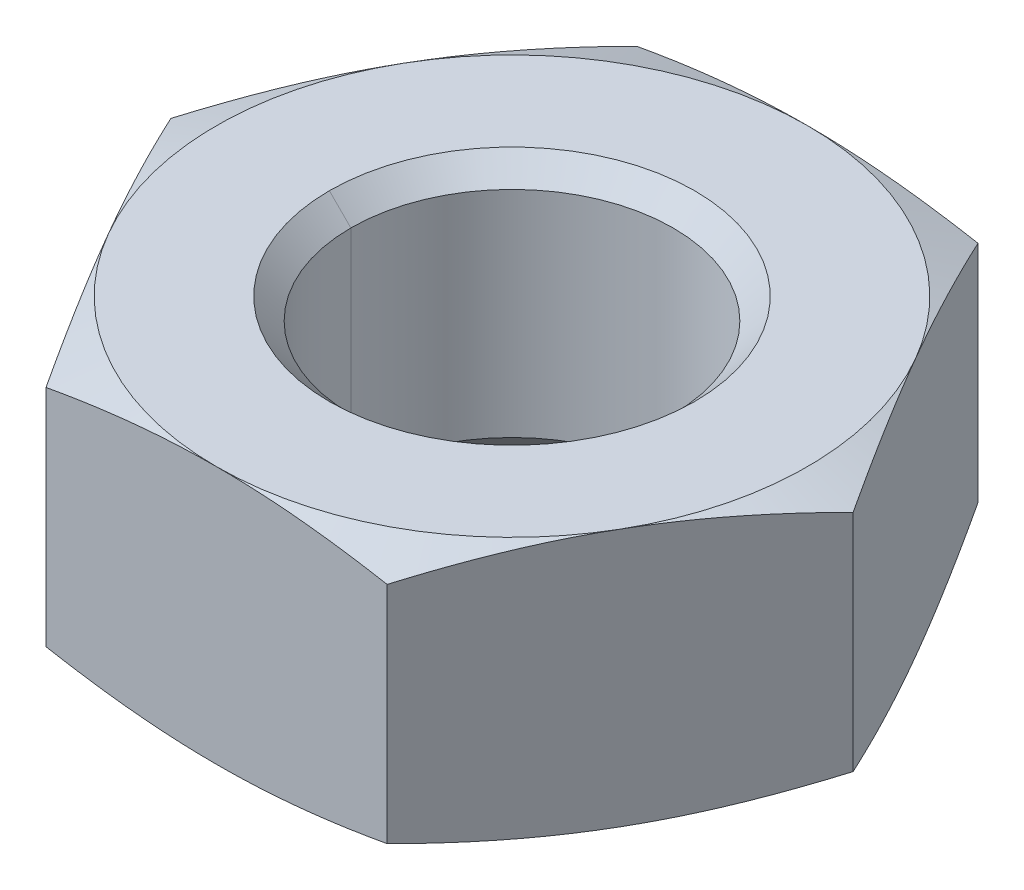
ISO-10303-21;
HEADER;
FILE_DESCRIPTION(('STEP AP214'),'2;1');
FILE_NAME('part.step','',(''),(''),'','','');
FILE_SCHEMA(('AUTOMOTIVE_DESIGN { 1 0 10303 214 1 1 1 1 }'));
ENDSEC;
DATA;
#1=APPLICATION_CONTEXT('core data for automotive mechanical design processes');
#2=APPLICATION_PROTOCOL_DEFINITION('international standard','automotive_design',2000,#1);
#3=PRODUCT_CONTEXT('',#1,'mechanical');
#4=PRODUCT('Part','Part','',(#3));
#5=PRODUCT_RELATED_PRODUCT_CATEGORY('part','',(#4));
#6=PRODUCT_DEFINITION_FORMATION('','',#4);
#7=PRODUCT_DEFINITION_CONTEXT('part definition',#1,'design');
#8=PRODUCT_DEFINITION('design','',#6,#7);
#9=PRODUCT_DEFINITION_SHAPE('','',#8);
#10=(LENGTH_UNIT() NAMED_UNIT(*) SI_UNIT(.MILLI.,.METRE.));
#11=(NAMED_UNIT(*) PLANE_ANGLE_UNIT() SI_UNIT($,.RADIAN.));
#12=(NAMED_UNIT(*) SI_UNIT($,.STERADIAN.) SOLID_ANGLE_UNIT());
#13=UNCERTAINTY_MEASURE_WITH_UNIT(LENGTH_MEASURE(1.E-05),#10,'distance_accuracy_value','');
#14=(GEOMETRIC_REPRESENTATION_CONTEXT(3) GLOBAL_UNCERTAINTY_ASSIGNED_CONTEXT((#13)) GLOBAL_UNIT_ASSIGNED_CONTEXT((#10,
#11,#12)) REPRESENTATION_CONTEXT('',''));
#15=CARTESIAN_POINT('',(0.,0.,0.));
#16=DIRECTION('',(0.,0.,1.));
#17=DIRECTION('',(1.,0.,0.));
#18=AXIS2_PLACEMENT_3D('',#15,#16,#17);
#19=CARTESIAN_POINT('',(0.,0.1000000000643,0.));
#20=DIRECTION('',(0.,-1.,0.));
#21=DIRECTION('',(0.,0.,-1.));
#22=AXIS2_PLACEMENT_3D('',#19,#20,#21);
#23=CONICAL_SURFACE('',#22,1.599999999936,0.7853981633973);
#24=DIRECTION('',(-0.707106781186548,0.707106781186548,1.09634755958007E-09));
#25=VECTOR('',#24,1.);
#26=CARTESIAN_POINT('',(1.699999999925,7.545016463458E-11,-9.167990307275E-10));
#27=LINE('',#26,#25);
#28=CARTESIAN_POINT('',(1.7,0.,0.));
#29=VERTEX_POINT('',#28);
#30=CARTESIAN_POINT('',(1.5,0.2,0.));
#31=VERTEX_POINT('',#30);
#32=EDGE_CURVE('E10',#29,#31,#27,.T.);
#33=ORIENTED_EDGE('',*,*,#32,.T.);
#34=CARTESIAN_POINT('',(0.,0.2,0.));
#35=DIRECTION('',(0.,1.,0.));
#36=DIRECTION('',(1.,0.,0.));
#37=AXIS2_PLACEMENT_3D('',#34,#35,#36);
#38=CIRCLE('',#37,1.5);
#39=CARTESIAN_POINT('',(-1.5,0.2,0.));
#40=VERTEX_POINT('',#39);
#41=EDGE_CURVE('E177',#31,#40,#38,.T.);
#42=ORIENTED_EDGE('',*,*,#41,.T.);
#43=DIRECTION('',(0.707106781186548,0.707106781186548,-1.09634604963507E-09));
#44=VECTOR('',#43,1.);
#45=CARTESIAN_POINT('',(-1.699999999925,7.545009061971E-11,9.16797816753E-10));
#46=LINE('',#45,#44);
#47=CARTESIAN_POINT('',(-1.7,0.,0.));
#48=VERTEX_POINT('',#47);
#49=EDGE_CURVE('E26',#48,#40,#46,.T.);
#50=ORIENTED_EDGE('',*,*,#49,.F.);
#51=CARTESIAN_POINT('',(0.,0.,0.));
#52=DIRECTION('',(0.,1.,0.));
#53=DIRECTION('',(1.,0.,0.));
#54=AXIS2_PLACEMENT_3D('',#51,#52,#53);
#55=CIRCLE('',#54,1.7);
#56=EDGE_CURVE('E215',#29,#48,#55,.T.);
#57=ORIENTED_EDGE('',*,*,#56,.F.);
#58=EDGE_LOOP('',(#33,#42,#50,#57));
#59=FACE_BOUND('',#58,.T.);
#60=ADVANCED_FACE('F15',(#59),#23,.F.);
#61=CARTESIAN_POINT('',(0.,0.1000000000643,0.));
#62=DIRECTION('',(0.,-1.,0.));
#63=DIRECTION('',(0.,0.,-1.));
#64=AXIS2_PLACEMENT_3D('',#61,#62,#63);
#65=CONICAL_SURFACE('',#64,1.599999999936,0.7853981633973);
#66=ORIENTED_EDGE('',*,*,#49,.T.);
#67=CARTESIAN_POINT('',(0.,0.2,0.));
#68=DIRECTION('',(0.,1.,0.));
#69=DIRECTION('',(-1.,0.,0.));
#70=AXIS2_PLACEMENT_3D('',#67,#68,#69);
#71=CIRCLE('',#70,1.5);
#72=EDGE_CURVE('E173',#40,#31,#71,.T.);
#73=ORIENTED_EDGE('',*,*,#72,.T.);
#74=ORIENTED_EDGE('',*,*,#32,.F.);
#75=CARTESIAN_POINT('',(0.,0.,0.));
#76=DIRECTION('',(0.,1.,0.));
#77=DIRECTION('',(-1.,0.,0.));
#78=AXIS2_PLACEMENT_3D('',#75,#76,#77);
#79=CIRCLE('',#78,1.7);
#80=EDGE_CURVE('E219',#48,#29,#79,.T.);
#81=ORIENTED_EDGE('',*,*,#80,.F.);
#82=EDGE_LOOP('',(#66,#73,#74,#81));
#83=FACE_BOUND('',#82,.T.);
#84=ADVANCED_FACE('F593',(#83),#65,.F.);
#85=CARTESIAN_POINT('',(0.,2.4,0.));
#86=DIRECTION('',(0.,1.,0.));
#87=DIRECTION('',(1.,0.,0.));
#88=AXIS2_PLACEMENT_3D('',#85,#86,#87);
#89=CYLINDRICAL_SURFACE('',#88,1.5);
#90=DIRECTION('',(0.,-1.,0.));
#91=VECTOR('',#90,1.);
#92=CARTESIAN_POINT('',(1.49999999995,2.19999999995,-6.067043243702E-10));
#93=LINE('',#92,#91);
#94=CARTESIAN_POINT('',(1.5,2.2,0.));
#95=VERTEX_POINT('',#94);
#96=EDGE_CURVE('E183',#95,#31,#93,.T.);
#97=ORIENTED_EDGE('',*,*,#96,.T.);
#98=ORIENTED_EDGE('',*,*,#72,.F.);
#99=DIRECTION('',(0.,-1.,0.));
#100=VECTOR('',#99,1.);
#101=CARTESIAN_POINT('',(-1.49999999995,2.19999999995,6.067043987456E-10));
#102=LINE('',#101,#100);
#103=CARTESIAN_POINT('',(-1.5,2.2,0.));
#104=VERTEX_POINT('',#103);
#105=EDGE_CURVE('E166',#104,#40,#102,.T.);
#106=ORIENTED_EDGE('',*,*,#105,.F.);
#107=CARTESIAN_POINT('',(0.,2.2,0.));
#108=DIRECTION('',(0.,-1.,0.));
#109=DIRECTION('',(1.,0.,0.));
#110=AXIS2_PLACEMENT_3D('',#107,#108,#109);
#111=CIRCLE('',#110,1.5);
#112=EDGE_CURVE('E171',#95,#104,#111,.T.);
#113=ORIENTED_EDGE('',*,*,#112,.F.);
#114=EDGE_LOOP('',(#97,#98,#106,#113));
#115=FACE_BOUND('',#114,.T.);
#116=ADVANCED_FACE('F169',(#115),#89,.F.);
#117=CARTESIAN_POINT('',(0.,2.4,0.));
#118=DIRECTION('',(0.,1.,0.));
#119=DIRECTION('',(1.,0.,0.));
#120=AXIS2_PLACEMENT_3D('',#117,#118,#119);
#121=CYLINDRICAL_SURFACE('',#120,1.5);
#122=ORIENTED_EDGE('',*,*,#105,.T.);
#123=ORIENTED_EDGE('',*,*,#41,.F.);
#124=ORIENTED_EDGE('',*,*,#96,.F.);
#125=CARTESIAN_POINT('',(0.,2.2,0.));
#126=DIRECTION('',(0.,-1.,0.));
#127=DIRECTION('',(-1.,0.,0.));
#128=AXIS2_PLACEMENT_3D('',#125,#126,#127);
#129=CIRCLE('',#128,1.5);
#130=EDGE_CURVE('E178',#104,#95,#129,.T.);
#131=ORIENTED_EDGE('',*,*,#130,.F.);
#132=EDGE_LOOP('',(#122,#123,#124,#131));
#133=FACE_BOUND('',#132,.T.);
#134=ADVANCED_FACE('F182',(#133),#121,.F.);
#135=CARTESIAN_POINT('',(0.,2.299999999936,0.));
#136=DIRECTION('',(0.,1.,0.));
#137=DIRECTION('',(0.,0.,-1.));
#138=AXIS2_PLACEMENT_3D('',#135,#136,#137);
#139=CONICAL_SURFACE('',#138,1.599999999936,0.7853981633973);
#140=DIRECTION('',(0.707106781186548,-0.707106781186548,-1.09634600416907E-09));
#141=VECTOR('',#140,1.);
#142=CARTESIAN_POINT('',(-1.699999999925,2.399999999925,9.167978763359E-10));
#143=LINE('',#142,#141);
#144=CARTESIAN_POINT('',(-1.7,2.4,0.));
#145=VERTEX_POINT('',#144);
#146=EDGE_CURVE('E186',#145,#104,#143,.T.);
#147=ORIENTED_EDGE('',*,*,#146,.T.);
#148=ORIENTED_EDGE('',*,*,#130,.T.);
#149=DIRECTION('',(-0.707106781186548,-0.707106781186548,1.09634648687207E-09));
#150=VECTOR('',#149,1.);
#151=CARTESIAN_POINT('',(1.699999999925,2.399999999925,-9.167979384894E-10));
#152=LINE('',#151,#150);
#153=CARTESIAN_POINT('',(1.7,2.4,0.));
#154=VERTEX_POINT('',#153);
#155=EDGE_CURVE('E198',#154,#95,#152,.T.);
#156=ORIENTED_EDGE('',*,*,#155,.F.);
#157=CARTESIAN_POINT('',(0.,2.4,0.));
#158=DIRECTION('',(0.,-1.,0.));
#159=DIRECTION('',(-1.,0.,0.));
#160=AXIS2_PLACEMENT_3D('',#157,#158,#159);
#161=CIRCLE('',#160,1.7);
#162=EDGE_CURVE('E192',#145,#154,#161,.T.);
#163=ORIENTED_EDGE('',*,*,#162,.F.);
#164=EDGE_LOOP('',(#147,#148,#156,#163));
#165=FACE_BOUND('',#164,.T.);
#166=ADVANCED_FACE('F190',(#165),#139,.F.);
#167=CARTESIAN_POINT('',(0.,2.299999999936,0.));
#168=DIRECTION('',(0.,1.,0.));
#169=DIRECTION('',(0.,0.,-1.));
#170=AXIS2_PLACEMENT_3D('',#167,#168,#169);
#171=CONICAL_SURFACE('',#170,1.599999999936,0.7853981633973);
#172=ORIENTED_EDGE('',*,*,#155,.T.);
#173=ORIENTED_EDGE('',*,*,#112,.T.);
#174=ORIENTED_EDGE('',*,*,#146,.F.);
#175=CARTESIAN_POINT('',(0.,2.4,0.));
#176=DIRECTION('',(0.,-1.,0.));
#177=DIRECTION('',(1.,0.,0.));
#178=AXIS2_PLACEMENT_3D('',#175,#176,#177);
#179=CIRCLE('',#178,1.7);
#180=EDGE_CURVE('E382',#154,#145,#179,.T.);
#181=ORIENTED_EDGE('',*,*,#180,.F.);
#182=EDGE_LOOP('',(#172,#173,#174,#181));
#183=FACE_BOUND('',#182,.T.);
#184=ADVANCED_FACE('F17',(#183),#171,.F.);
#185=CARTESIAN_POINT('',(1.587713240271,0.,-2.75));
#186=DIRECTION('',(0.,0.,-1.));
#187=DIRECTION('',(0.,-1.,0.));
#188=AXIS2_PLACEMENT_3D('',#185,#186,#187);
#189=PLANE('',#188);
#190=CARTESIAN_POINT('',(0.,2.4,-2.75));
#191=CARTESIAN_POINT('',(0.1052224611715,2.4,-2.75));
#192=CARTESIAN_POINT('',(0.3154470286676,2.395587915311,-2.75));
#193=CARTESIAN_POINT('',(0.6299683233626,2.376095210962,-2.75));
#194=CARTESIAN_POINT('',(0.9441379917555,2.344497945483,-2.75));
#195=CARTESIAN_POINT('',(1.26032303949,2.301595107121,-2.75));
#196=CARTESIAN_POINT('',(1.47775424727,2.265168324435,-2.75));
#197=CARTESIAN_POINT('',(1.587713240271,2.245157424214,-2.75));
#198=(BOUNDED_CURVE() B_SPLINE_CURVE(3,(#190,#191,#192,#193,#194,#195,#196,#197),.UNSPECIFIED.,
.F.,.F.) B_SPLINE_CURVE_WITH_KNOTS((4,1,1,1,1,4),(0.,0.2,0.4,0.6,0.8,1.),
.UNSPECIFIED.) CURVE() GEOMETRIC_REPRESENTATION_ITEM() RATIONAL_B_SPLINE_CURVE((1.,1.,1.,1.,1.,
1.,1.,1.)) REPRESENTATION_ITEM(''));
#199=CARTESIAN_POINT('',(0.,2.4,-2.75));
#200=VERTEX_POINT('',#199);
#201=CARTESIAN_POINT('',(1.587713240271,2.245157424214,-2.75));
#202=VERTEX_POINT('',#201);
#203=EDGE_CURVE('E315',#200,#202,#198,.T.);
#204=ORIENTED_EDGE('',*,*,#203,.T.);
#205=DIRECTION('',(0.,1.,0.));
#206=VECTOR('',#205,1.);
#207=CARTESIAN_POINT('',(1.587713240271,0.1548425757863,-2.75));
#208=LINE('',#207,#206);
#209=CARTESIAN_POINT('',(1.587713240271,0.1548425757863,-2.75));
#210=VERTEX_POINT('',#209);
#211=EDGE_CURVE('E116',#210,#202,#208,.T.);
#212=ORIENTED_EDGE('',*,*,#211,.F.);
#213=CARTESIAN_POINT('',(0.,0.,-2.75));
#214=CARTESIAN_POINT('',(0.1052224611715,0.,-2.75));
#215=CARTESIAN_POINT('',(0.3154470286676,0.004412084689004,-2.75));
#216=CARTESIAN_POINT('',(0.6299683233626,0.02390478903786,-2.75));
#217=CARTESIAN_POINT('',(0.9441379917555,0.05550205451655,-2.75));
#218=CARTESIAN_POINT('',(1.26032303949,0.09840489287872,-2.75));
#219=CARTESIAN_POINT('',(1.47775424727,0.1348316755651,-2.75));
#220=CARTESIAN_POINT('',(1.587713240271,0.1548425757863,-2.75));
#221=(BOUNDED_CURVE() B_SPLINE_CURVE(3,(#213,#214,#215,#216,#217,#218,#219,#220),.UNSPECIFIED.,
.F.,.F.) B_SPLINE_CURVE_WITH_KNOTS((4,1,1,1,1,4),(0.,0.2,0.4,0.6,0.8,1.),
.UNSPECIFIED.) CURVE() GEOMETRIC_REPRESENTATION_ITEM() RATIONAL_B_SPLINE_CURVE((1.,1.,1.,1.,1.,
1.,1.,1.)) REPRESENTATION_ITEM(''));
#222=CARTESIAN_POINT('',(0.,0.,-2.75));
#223=VERTEX_POINT('',#222);
#224=EDGE_CURVE('E239',#223,#210,#221,.T.);
#225=ORIENTED_EDGE('',*,*,#224,.F.);
#226=CARTESIAN_POINT('',(-1.587713240271,0.1548425757863,-2.75));
#227=CARTESIAN_POINT('',(-1.477763319488,0.1348333265736,-2.75));
#228=CARTESIAN_POINT('',(-1.260337990898,0.09840638658966,-2.75));
#229=CARTESIAN_POINT('',(-0.9440452113293,0.05549027522838,-2.75));
#230=CARTESIAN_POINT('',(-0.6298861577299,0.0238985917992,-2.75));
#231=CARTESIAN_POINT('',(-0.3154012683404,0.004410687574094,-2.75));
#232=CARTESIAN_POINT('',(-0.1052057242757,0.,-2.75));
#233=CARTESIAN_POINT('',(0.,0.,-2.75));
#234=(BOUNDED_CURVE() B_SPLINE_CURVE(3,(#226,#227,#228,#229,#230,#231,#232,#233),.UNSPECIFIED.,
.F.,.F.) B_SPLINE_CURVE_WITH_KNOTS((4,1,1,1,1,4),(0.,0.2,0.4,0.6,0.8,1.),
.UNSPECIFIED.) CURVE() GEOMETRIC_REPRESENTATION_ITEM() RATIONAL_B_SPLINE_CURVE((1.,1.,1.,1.,1.,
1.,1.,1.)) REPRESENTATION_ITEM(''));
#235=CARTESIAN_POINT('',(-1.587713240271,0.1548425757863,-2.75));
#236=VERTEX_POINT('',#235);
#237=EDGE_CURVE('E256',#236,#223,#234,.T.);
#238=ORIENTED_EDGE('',*,*,#237,.F.);
#239=DIRECTION('',(0.,1.,0.));
#240=VECTOR('',#239,1.);
#241=CARTESIAN_POINT('',(-1.587713240271,0.1548425757863,-2.75));
#242=LINE('',#241,#240);
#243=CARTESIAN_POINT('',(-1.587713240271,2.245157424214,-2.75));
#244=VERTEX_POINT('',#243);
#245=EDGE_CURVE('E19',#236,#244,#242,.T.);
#246=ORIENTED_EDGE('',*,*,#245,.T.);
#247=CARTESIAN_POINT('',(-1.587713240271,2.245157424214,-2.75));
#248=CARTESIAN_POINT('',(-1.477763319488,2.265166673426,-2.75));
#249=CARTESIAN_POINT('',(-1.260337990898,2.30159361341,-2.75));
#250=CARTESIAN_POINT('',(-0.9440452113293,2.344509724772,-2.75));
#251=CARTESIAN_POINT('',(-0.6298861577299,2.376101408201,-2.75));
#252=CARTESIAN_POINT('',(-0.3154012683404,2.395589312426,-2.75));
#253=CARTESIAN_POINT('',(-0.1052057242757,2.4,-2.75));
#254=CARTESIAN_POINT('',(0.,2.4,-2.75));
#255=(BOUNDED_CURVE() B_SPLINE_CURVE(3,(#247,#248,#249,#250,#251,#252,#253,#254),.UNSPECIFIED.,
.F.,.F.) B_SPLINE_CURVE_WITH_KNOTS((4,1,1,1,1,4),(0.,0.2,0.4,0.6,0.8,1.),
.UNSPECIFIED.) CURVE() GEOMETRIC_REPRESENTATION_ITEM() RATIONAL_B_SPLINE_CURVE((1.,1.,1.,1.,1.,
1.,1.,1.)) REPRESENTATION_ITEM(''));
#256=EDGE_CURVE('E322',#244,#200,#255,.T.);
#257=ORIENTED_EDGE('',*,*,#256,.T.);
#258=EDGE_LOOP('',(#204,#212,#225,#238,#246,#257));
#259=FACE_BOUND('',#258,.T.);
#260=ADVANCED_FACE('F542',(#259),#189,.T.);
#261=CARTESIAN_POINT('',(-1.587713240271,0.,-2.75));
#262=DIRECTION('',(-0.866025403784429,0.,-0.500000000000017));
#263=DIRECTION('',(-0.500000000000017,0.,0.866025403784429));
#264=AXIS2_PLACEMENT_3D('',#261,#262,#263);
#265=PLANE('',#264);
#266=CARTESIAN_POINT('',(-2.381569860407,2.4,-1.375));
#267=CARTESIAN_POINT('',(-2.328958629821,2.4,-1.466125324423));
#268=CARTESIAN_POINT('',(-2.223846346073,2.395587915311,-1.648185140374));
#269=CARTESIAN_POINT('',(-2.066585698726,2.376095210962,-1.920568571612));
#270=CARTESIAN_POINT('',(-1.909500864529,2.344497945483,-2.192647485538));
#271=CARTESIAN_POINT('',(-1.751408340662,2.301595107121,-2.466471769173));
#272=CARTESIAN_POINT('',(-1.642692736772,2.265168324435,-2.654772718686));
#273=CARTESIAN_POINT('',(-1.587713240271,2.245157424214,-2.75));
#274=(BOUNDED_CURVE() B_SPLINE_CURVE(3,(#266,#267,#268,#269,#270,#271,#272,#273),.UNSPECIFIED.,
.F.,.F.) B_SPLINE_CURVE_WITH_KNOTS((4,1,1,1,1,4),(0.,0.2,0.4,0.6,0.8,1.),
.UNSPECIFIED.) CURVE() GEOMETRIC_REPRESENTATION_ITEM() RATIONAL_B_SPLINE_CURVE((1.,1.,1.,1.,1.,
1.,1.,1.)) REPRESENTATION_ITEM(''));
#275=CARTESIAN_POINT('',(-2.381569860407,2.4,-1.375));
#276=VERTEX_POINT('',#275);
#277=EDGE_CURVE('E331',#276,#244,#274,.T.);
#278=ORIENTED_EDGE('',*,*,#277,.T.);
#279=ORIENTED_EDGE('',*,*,#245,.F.);
#280=CARTESIAN_POINT('',(-2.381569860407,0.,-1.375));
#281=CARTESIAN_POINT('',(-2.328958629821,0.,-1.466125324423));
#282=CARTESIAN_POINT('',(-2.223846346073,0.004412084689005,-1.648185140374));
#283=CARTESIAN_POINT('',(-2.066585698726,0.02390478903786,-1.920568571612));
#284=CARTESIAN_POINT('',(-1.909500864529,0.05550205451655,-2.192647485538));
#285=CARTESIAN_POINT('',(-1.751408340662,0.09840489287872,-2.466471769173));
#286=CARTESIAN_POINT('',(-1.642692736772,0.1348316755651,-2.654772718686));
#287=CARTESIAN_POINT('',(-1.587713240271,0.1548425757863,-2.75));
#288=(BOUNDED_CURVE() B_SPLINE_CURVE(3,(#280,#281,#282,#283,#284,#285,#286,#287),.UNSPECIFIED.,
.F.,.F.) B_SPLINE_CURVE_WITH_KNOTS((4,1,1,1,1,4),(0.,0.2,0.4,0.6,0.8,1.),
.UNSPECIFIED.) CURVE() GEOMETRIC_REPRESENTATION_ITEM() RATIONAL_B_SPLINE_CURVE((1.,1.,1.,1.,1.,
1.,1.,1.)) REPRESENTATION_ITEM(''));
#289=CARTESIAN_POINT('',(-2.381569860407,0.,-1.375));
#290=VERTEX_POINT('',#289);
#291=EDGE_CURVE('E238',#290,#236,#288,.T.);
#292=ORIENTED_EDGE('',*,*,#291,.F.);
#293=CARTESIAN_POINT('',(-3.175426480543,0.1548425757863,0.));
#294=CARTESIAN_POINT('',(-3.120451520151,0.1348333265736,-0.09521942454291));
#295=CARTESIAN_POINT('',(-3.011738855856,0.09840638658966,-0.2835152825278));
#296=CARTESIAN_POINT('',(-2.853592466072,0.05549027522838,-0.5574328646678));
#297=CARTESIAN_POINT('',(-2.696512939272,0.0238985917992,-0.8295025859137));
#298=CARTESIAN_POINT('',(-2.539270494577,0.004410687574094,-1.101854489231));
#299=CARTESIAN_POINT('',(-2.434172722545,0.,-1.283889170154));
#300=CARTESIAN_POINT('',(-2.381569860407,0.,-1.375));
#301=(BOUNDED_CURVE() B_SPLINE_CURVE(3,(#293,#294,#295,#296,#297,#298,#299,#300),.UNSPECIFIED.,
.F.,.F.) B_SPLINE_CURVE_WITH_KNOTS((4,1,1,1,1,4),(0.,0.2,0.4,0.6,0.8,1.),
.UNSPECIFIED.) CURVE() GEOMETRIC_REPRESENTATION_ITEM() RATIONAL_B_SPLINE_CURVE((1.,1.,1.,1.,1.,
1.,1.,1.)) REPRESENTATION_ITEM(''));
#302=CARTESIAN_POINT('',(-3.175426480543,0.1548425757863,0.));
#303=VERTEX_POINT('',#302);
#304=EDGE_CURVE('E227',#303,#290,#301,.T.);
#305=ORIENTED_EDGE('',*,*,#304,.F.);
#306=DIRECTION('',(0.,1.,0.));
#307=VECTOR('',#306,1.);
#308=CARTESIAN_POINT('',(-3.175426480543,0.1548425757863,0.));
#309=LINE('',#308,#307);
#310=CARTESIAN_POINT('',(-3.175426480543,2.245157424214,0.));
#311=VERTEX_POINT('',#310);
#312=EDGE_CURVE('E364',#303,#311,#309,.T.);
#313=ORIENTED_EDGE('',*,*,#312,.T.);
#314=CARTESIAN_POINT('',(-3.175426480543,2.245157424214,0.));
#315=CARTESIAN_POINT('',(-3.120451520151,2.265166673426,-0.09521942454291));
#316=CARTESIAN_POINT('',(-3.011738855856,2.30159361341,-0.2835152825278));
#317=CARTESIAN_POINT('',(-2.853592466072,2.344509724772,-0.5574328646678));
#318=CARTESIAN_POINT('',(-2.696512939272,2.376101408201,-0.8295025859137));
#319=CARTESIAN_POINT('',(-2.539270494577,2.395589312426,-1.101854489231));
#320=CARTESIAN_POINT('',(-2.434172722545,2.4,-1.283889170154));
#321=CARTESIAN_POINT('',(-2.381569860407,2.4,-1.375));
#322=(BOUNDED_CURVE() B_SPLINE_CURVE(3,(#314,#315,#316,#317,#318,#319,#320,#321),.UNSPECIFIED.,
.F.,.F.) B_SPLINE_CURVE_WITH_KNOTS((4,1,1,1,1,4),(0.,0.2,0.4,0.6,0.8,1.),
.UNSPECIFIED.) CURVE() GEOMETRIC_REPRESENTATION_ITEM() RATIONAL_B_SPLINE_CURVE((1.,1.,1.,1.,1.,
1.,1.,1.)) REPRESENTATION_ITEM(''));
#323=EDGE_CURVE('E286',#311,#276,#322,.T.);
#324=ORIENTED_EDGE('',*,*,#323,.T.);
#325=EDGE_LOOP('',(#278,#279,#292,#305,#313,#324));
#326=FACE_BOUND('',#325,.T.);
#327=ADVANCED_FACE('F570',(#326),#265,.T.);
#328=CARTESIAN_POINT('',(-3.175426480543,0.,0.));
#329=DIRECTION('',(-0.866025403784429,0.,0.500000000000017));
#330=DIRECTION('',(0.,1.,0.));
#331=AXIS2_PLACEMENT_3D('',#328,#329,#330);
#332=PLANE('',#331);
#333=CARTESIAN_POINT('',(-2.381569860407,2.4,1.375));
#334=CARTESIAN_POINT('',(-2.434181090993,2.4,1.283874675577));
#335=CARTESIAN_POINT('',(-2.539293374741,2.395587915311,1.101814859626));
#336=CARTESIAN_POINT('',(-2.696554022089,2.376095210962,0.8294314283885));
#337=CARTESIAN_POINT('',(-2.853638856285,2.344497945483,0.5573525144617));
#338=CARTESIAN_POINT('',(-3.011731380152,2.301595107121,0.2835282308269));
#339=CARTESIAN_POINT('',(-3.120446984042,2.265168324435,0.09522728131376));
#340=CARTESIAN_POINT('',(-3.175426480543,2.245157424214,0.));
#341=(BOUNDED_CURVE() B_SPLINE_CURVE(3,(#333,#334,#335,#336,#337,#338,#339,#340),.UNSPECIFIED.,
.F.,.F.) B_SPLINE_CURVE_WITH_KNOTS((4,1,1,1,1,4),(0.,0.2,0.4,0.6,0.8,1.),
.UNSPECIFIED.) CURVE() GEOMETRIC_REPRESENTATION_ITEM() RATIONAL_B_SPLINE_CURVE((1.,1.,1.,1.,1.,
1.,1.,1.)) REPRESENTATION_ITEM(''));
#342=CARTESIAN_POINT('',(-2.381569860407,2.4,1.375));
#343=VERTEX_POINT('',#342);
#344=EDGE_CURVE('E214',#343,#311,#341,.T.);
#345=ORIENTED_EDGE('',*,*,#344,.T.);
#346=ORIENTED_EDGE('',*,*,#312,.F.);
#347=CARTESIAN_POINT('',(-2.381569860407,0.,1.375));
#348=CARTESIAN_POINT('',(-2.434181090993,0.,1.283874675577));
#349=CARTESIAN_POINT('',(-2.539293374741,0.004412084689005,1.101814859626));
#350=CARTESIAN_POINT('',(-2.696554022089,0.02390478903786,0.8294314283885));
#351=CARTESIAN_POINT('',(-2.853638856285,0.05550205451655,0.5573525144617));
#352=CARTESIAN_POINT('',(-3.011731380152,0.09840489287872,0.2835282308269));
#353=CARTESIAN_POINT('',(-3.120446984042,0.1348316755651,0.09522728131376));
#354=CARTESIAN_POINT('',(-3.175426480543,0.1548425757863,0.));
#355=(BOUNDED_CURVE() B_SPLINE_CURVE(3,(#347,#348,#349,#350,#351,#352,#353,#354),.UNSPECIFIED.,
.F.,.F.) B_SPLINE_CURVE_WITH_KNOTS((4,1,1,1,1,4),(0.,0.2,0.4,0.6,0.8,1.),
.UNSPECIFIED.) CURVE() GEOMETRIC_REPRESENTATION_ITEM() RATIONAL_B_SPLINE_CURVE((1.,1.,1.,1.,1.,
1.,1.,1.)) REPRESENTATION_ITEM(''));
#356=CARTESIAN_POINT('',(-2.381569860407,0.,1.375));
#357=VERTEX_POINT('',#356);
#358=EDGE_CURVE('E355',#357,#303,#355,.T.);
#359=ORIENTED_EDGE('',*,*,#358,.F.);
#360=CARTESIAN_POINT('',(-1.587713240271,0.1548425757863,2.75));
#361=CARTESIAN_POINT('',(-1.642688200663,0.1348333265736,2.654780575457));
#362=CARTESIAN_POINT('',(-1.751400864958,0.09840638658966,2.466484717472));
#363=CARTESIAN_POINT('',(-1.909547254743,0.05549027522838,2.192567135332));
#364=CARTESIAN_POINT('',(-2.066626781542,0.0238985917992,1.920497414086));
#365=CARTESIAN_POINT('',(-2.223869226237,0.004410687574094,1.648145510769));
#366=CARTESIAN_POINT('',(-2.328966998269,0.,1.466110829846));
#367=CARTESIAN_POINT('',(-2.381569860407,0.,1.375));
#368=(BOUNDED_CURVE() B_SPLINE_CURVE(3,(#360,#361,#362,#363,#364,#365,#366,#367),.UNSPECIFIED.,
.F.,.F.) B_SPLINE_CURVE_WITH_KNOTS((4,1,1,1,1,4),(0.,0.2,0.4,0.6,0.8,1.),
.UNSPECIFIED.) CURVE() GEOMETRIC_REPRESENTATION_ITEM() RATIONAL_B_SPLINE_CURVE((1.,1.,1.,1.,1.,
1.,1.,1.)) REPRESENTATION_ITEM(''));
#369=CARTESIAN_POINT('',(-1.587713240271,0.1548425757863,2.75));
#370=VERTEX_POINT('',#369);
#371=EDGE_CURVE('E403',#370,#357,#368,.T.);
#372=ORIENTED_EDGE('',*,*,#371,.F.);
#373=DIRECTION('',(0.,1.,0.));
#374=VECTOR('',#373,1.);
#375=CARTESIAN_POINT('',(-1.587713240271,0.1548425757863,2.75));
#376=LINE('',#375,#374);
#377=CARTESIAN_POINT('',(-1.587713240271,2.245157424214,2.75));
#378=VERTEX_POINT('',#377);
#379=EDGE_CURVE('E345',#370,#378,#376,.T.);
#380=ORIENTED_EDGE('',*,*,#379,.T.);
#381=CARTESIAN_POINT('',(-1.587713240271,2.245157424214,2.75));
#382=CARTESIAN_POINT('',(-1.642688200663,2.265166673426,2.654780575457));
#383=CARTESIAN_POINT('',(-1.751400864958,2.30159361341,2.466484717472));
#384=CARTESIAN_POINT('',(-1.909547254743,2.344509724772,2.192567135332));
#385=CARTESIAN_POINT('',(-2.066626781542,2.376101408201,1.920497414086));
#386=CARTESIAN_POINT('',(-2.223869226237,2.395589312426,1.648145510769));
#387=CARTESIAN_POINT('',(-2.328966998269,2.4,1.466110829846));
#388=CARTESIAN_POINT('',(-2.381569860407,2.4,1.375));
#389=(BOUNDED_CURVE() B_SPLINE_CURVE(3,(#381,#382,#383,#384,#385,#386,#387,#388),.UNSPECIFIED.,
.F.,.F.) B_SPLINE_CURVE_WITH_KNOTS((4,1,1,1,1,4),(0.,0.2,0.4,0.6,0.8,1.),
.UNSPECIFIED.) CURVE() GEOMETRIC_REPRESENTATION_ITEM() RATIONAL_B_SPLINE_CURVE((1.,1.,1.,1.,1.,
1.,1.,1.)) REPRESENTATION_ITEM(''));
#390=EDGE_CURVE('E273',#378,#343,#389,.T.);
#391=ORIENTED_EDGE('',*,*,#390,.T.);
#392=EDGE_LOOP('',(#345,#346,#359,#372,#380,#391));
#393=FACE_BOUND('',#392,.T.);
#394=ADVANCED_FACE('F400',(#393),#332,.T.);
#395=CARTESIAN_POINT('',(-1.587713240271,0.,2.75));
#396=DIRECTION('',(0.,0.,1.));
#397=DIRECTION('',(1.,0.,0.));
#398=AXIS2_PLACEMENT_3D('',#395,#396,#397);
#399=PLANE('',#398);
#400=CARTESIAN_POINT('',(0.,2.4,2.75));
#401=CARTESIAN_POINT('',(-0.1052224611715,2.4,2.75));
#402=CARTESIAN_POINT('',(-0.3154470286676,2.395587915311,2.75));
#403=CARTESIAN_POINT('',(-0.6299683233626,2.376095210962,2.75));
#404=CARTESIAN_POINT('',(-0.9441379917555,2.344497945483,2.75));
#405=CARTESIAN_POINT('',(-1.26032303949,2.301595107121,2.75));
#406=CARTESIAN_POINT('',(-1.47775424727,2.265168324435,2.75));
#407=CARTESIAN_POINT('',(-1.587713240271,2.245157424214,2.75));
#408=(BOUNDED_CURVE() B_SPLINE_CURVE(3,(#400,#401,#402,#403,#404,#405,#406,#407),.UNSPECIFIED.,
.F.,.F.) B_SPLINE_CURVE_WITH_KNOTS((4,1,1,1,1,4),(0.,0.2,0.4,0.6,0.8,1.),
.UNSPECIFIED.) CURVE() GEOMETRIC_REPRESENTATION_ITEM() RATIONAL_B_SPLINE_CURVE((1.,1.,1.,1.,1.,
1.,1.,1.)) REPRESENTATION_ITEM(''));
#409=CARTESIAN_POINT('',(0.,2.4,2.75));
#410=VERTEX_POINT('',#409);
#411=EDGE_CURVE('E248',#410,#378,#408,.T.);
#412=ORIENTED_EDGE('',*,*,#411,.T.);
#413=ORIENTED_EDGE('',*,*,#379,.F.);
#414=CARTESIAN_POINT('',(0.,0.,2.75));
#415=CARTESIAN_POINT('',(-0.1052224611715,0.,2.75));
#416=CARTESIAN_POINT('',(-0.3154470286676,0.004412084689004,2.75));
#417=CARTESIAN_POINT('',(-0.6299683233626,0.02390478903786,2.75));
#418=CARTESIAN_POINT('',(-0.9441379917555,0.05550205451655,2.75));
#419=CARTESIAN_POINT('',(-1.26032303949,0.09840489287872,2.75));
#420=CARTESIAN_POINT('',(-1.47775424727,0.1348316755651,2.75));
#421=CARTESIAN_POINT('',(-1.587713240271,0.1548425757863,2.75));
#422=(BOUNDED_CURVE() B_SPLINE_CURVE(3,(#414,#415,#416,#417,#418,#419,#420,#421),.UNSPECIFIED.,
.F.,.F.) B_SPLINE_CURVE_WITH_KNOTS((4,1,1,1,1,4),(0.,0.2,0.4,0.6,0.8,1.),
.UNSPECIFIED.) CURVE() GEOMETRIC_REPRESENTATION_ITEM() RATIONAL_B_SPLINE_CURVE((1.,1.,1.,1.,1.,
1.,1.,1.)) REPRESENTATION_ITEM(''));
#423=CARTESIAN_POINT('',(0.,0.,2.75));
#424=VERTEX_POINT('',#423);
#425=EDGE_CURVE('E265',#424,#370,#422,.T.);
#426=ORIENTED_EDGE('',*,*,#425,.F.);
#427=CARTESIAN_POINT('',(1.587713240271,0.1548425757863,2.75));
#428=CARTESIAN_POINT('',(1.477763319488,0.1348333265736,2.75));
#429=CARTESIAN_POINT('',(1.260337990898,0.09840638658966,2.75));
#430=CARTESIAN_POINT('',(0.9440452113293,0.05549027522838,2.75));
#431=CARTESIAN_POINT('',(0.6298861577299,0.0238985917992,2.75));
#432=CARTESIAN_POINT('',(0.3154012683404,0.004410687574094,2.75));
#433=CARTESIAN_POINT('',(0.1052057242757,0.,2.75));
#434=CARTESIAN_POINT('',(0.,0.,2.75));
#435=(BOUNDED_CURVE() B_SPLINE_CURVE(3,(#427,#428,#429,#430,#431,#432,#433,#434),.UNSPECIFIED.,
.F.,.F.) B_SPLINE_CURVE_WITH_KNOTS((4,1,1,1,1,4),(0.,0.2,0.4,0.6,0.8,1.),
.UNSPECIFIED.) CURVE() GEOMETRIC_REPRESENTATION_ITEM() RATIONAL_B_SPLINE_CURVE((1.,1.,1.,1.,1.,
1.,1.,1.)) REPRESENTATION_ITEM(''));
#436=CARTESIAN_POINT('',(1.587713240271,0.1548425757863,2.75));
#437=VERTEX_POINT('',#436);
#438=EDGE_CURVE('E255',#437,#424,#435,.T.);
#439=ORIENTED_EDGE('',*,*,#438,.F.);
#440=DIRECTION('',(0.,1.,0.));
#441=VECTOR('',#440,1.);
#442=CARTESIAN_POINT('',(1.587713240271,0.1548425757863,2.75));
#443=LINE('',#442,#441);
#444=CARTESIAN_POINT('',(1.587713240271,2.245157424214,2.75));
#445=VERTEX_POINT('',#444);
#446=EDGE_CURVE('E346',#437,#445,#443,.T.);
#447=ORIENTED_EDGE('',*,*,#446,.T.);
#448=CARTESIAN_POINT('',(1.587713240271,2.245157424214,2.75));
#449=CARTESIAN_POINT('',(1.477763319488,2.265166673426,2.75));
#450=CARTESIAN_POINT('',(1.260337990898,2.30159361341,2.75));
#451=CARTESIAN_POINT('',(0.9440452113293,2.344509724772,2.75));
#452=CARTESIAN_POINT('',(0.6298861577299,2.376101408201,2.75));
#453=CARTESIAN_POINT('',(0.3154012683404,2.395589312426,2.75));
#454=CARTESIAN_POINT('',(0.1052057242757,2.4,2.75));
#455=CARTESIAN_POINT('',(0.,2.4,2.75));
#456=(BOUNDED_CURVE() B_SPLINE_CURVE(3,(#448,#449,#450,#451,#452,#453,#454,#455),.UNSPECIFIED.,
.F.,.F.) B_SPLINE_CURVE_WITH_KNOTS((4,1,1,1,1,4),(0.,0.2,0.4,0.6,0.8,1.),
.UNSPECIFIED.) CURVE() GEOMETRIC_REPRESENTATION_ITEM() RATIONAL_B_SPLINE_CURVE((1.,1.,1.,1.,1.,
1.,1.,1.)) REPRESENTATION_ITEM(''));
#457=EDGE_CURVE('E293',#445,#410,#456,.T.);
#458=ORIENTED_EDGE('',*,*,#457,.T.);
#459=EDGE_LOOP('',(#412,#413,#426,#439,#447,#458));
#460=FACE_BOUND('',#459,.T.);
#461=ADVANCED_FACE('F407',(#460),#399,.T.);
#462=CARTESIAN_POINT('',(0.,0.07742128789313,0.));
#463=DIRECTION('',(0.,1.,0.));
#464=DIRECTION('',(1.,0.,0.));
#465=AXIS2_PLACEMENT_3D('',#462,#463,#464);
#466=CONICAL_SURFACE('',#465,2.962713240271,1.2217304763958);
#467=CARTESIAN_POINT('',(2.381569860407,0.,-1.375));
#468=CARTESIAN_POINT('',(2.434181090993,0.,-1.283874675577));
#469=CARTESIAN_POINT('',(2.539293374741,0.004412084689004,-1.101814859626));
#470=CARTESIAN_POINT('',(2.696554022089,0.02390478903786,-0.8294314283885));
#471=CARTESIAN_POINT('',(2.853638856285,0.05550205451655,-0.5573525144617));
#472=CARTESIAN_POINT('',(3.011731380152,0.09840489287872,-0.2835282308269));
#473=CARTESIAN_POINT('',(3.120446984042,0.1348316755651,-0.09522728131376));
#474=CARTESIAN_POINT('',(3.175426480543,0.1548425757863,0.));
#475=(BOUNDED_CURVE() B_SPLINE_CURVE(3,(#467,#468,#469,#470,#471,#472,#473,#474),.UNSPECIFIED.,
.F.,.F.) B_SPLINE_CURVE_WITH_KNOTS((4,1,1,1,1,4),(0.,0.2,0.4,0.6,0.8,1.),
.UNSPECIFIED.) CURVE() GEOMETRIC_REPRESENTATION_ITEM() RATIONAL_B_SPLINE_CURVE((1.,1.,1.,1.,1.,
1.,1.,1.)) REPRESENTATION_ITEM(''));
#476=CARTESIAN_POINT('',(2.381569860407,0.,-1.375));
#477=VERTEX_POINT('',#476);
#478=CARTESIAN_POINT('',(3.175426480543,0.1548425757863,0.));
#479=VERTEX_POINT('',#478);
#480=EDGE_CURVE('E272',#477,#479,#475,.T.);
#481=ORIENTED_EDGE('',*,*,#480,.T.);
#482=CARTESIAN_POINT('',(3.175426480543,0.1548425757863,0.));
#483=CARTESIAN_POINT('',(3.120451520151,0.1348333265736,0.09521942454291));
#484=CARTESIAN_POINT('',(3.011738855856,0.09840638658966,0.2835152825278));
#485=CARTESIAN_POINT('',(2.853592466072,0.05549027522838,0.5574328646678));
#486=CARTESIAN_POINT('',(2.696512939272,0.0238985917992,0.8295025859137));
#487=CARTESIAN_POINT('',(2.539270494577,0.004410687574093,1.101854489231));
#488=CARTESIAN_POINT('',(2.434172722545,0.,1.283889170154));
#489=CARTESIAN_POINT('',(2.381569860407,0.,1.375));
#490=(BOUNDED_CURVE() B_SPLINE_CURVE(3,(#482,#483,#484,#485,#486,#487,#488,#489),.UNSPECIFIED.,
.F.,.F.) B_SPLINE_CURVE_WITH_KNOTS((4,1,1,1,1,4),(0.,0.2,0.4,0.6,0.8,1.),
.UNSPECIFIED.) CURVE() GEOMETRIC_REPRESENTATION_ITEM() RATIONAL_B_SPLINE_CURVE((1.,1.,1.,1.,1.,
1.,1.,1.)) REPRESENTATION_ITEM(''));
#491=CARTESIAN_POINT('',(2.381569860407,0.,1.375));
#492=VERTEX_POINT('',#491);
#493=EDGE_CURVE('E340',#479,#492,#490,.T.);
#494=ORIENTED_EDGE('',*,*,#493,.T.);
#495=CARTESIAN_POINT('',(0.,0.,0.));
#496=DIRECTION('',(0.,-1.,0.));
#497=DIRECTION('',(0.866025403784429,0.,-0.500000000000017));
#498=AXIS2_PLACEMENT_3D('',#495,#496,#497);
#499=CIRCLE('',#498,2.75);
#500=EDGE_CURVE('E287',#477,#492,#499,.T.);
#501=ORIENTED_EDGE('',*,*,#500,.F.);
#502=EDGE_LOOP('',(#481,#494,#501));
#503=FACE_BOUND('',#502,.T.);
#504=ADVANCED_FACE('F580',(#503),#466,.T.);
#505=CARTESIAN_POINT('',(1.587713240271,0.,2.75));
#506=DIRECTION('',(0.866025403784429,0.,0.500000000000017));
#507=DIRECTION('',(0.,-1.,0.));
#508=AXIS2_PLACEMENT_3D('',#505,#506,#507);
#509=PLANE('',#508);
#510=CARTESIAN_POINT('',(2.381569860407,2.4,1.375));
#511=CARTESIAN_POINT('',(2.328958629821,2.4,1.466125324423));
#512=CARTESIAN_POINT('',(2.223846346073,2.395587915311,1.648185140374));
#513=CARTESIAN_POINT('',(2.066585698726,2.376095210962,1.920568571612));
#514=CARTESIAN_POINT('',(1.909500864529,2.344497945483,2.192647485538));
#515=CARTESIAN_POINT('',(1.751408340662,2.301595107121,2.466471769173));
#516=CARTESIAN_POINT('',(1.642692736772,2.265168324435,2.654772718686));
#517=CARTESIAN_POINT('',(1.587713240271,2.245157424214,2.75));
#518=(BOUNDED_CURVE() B_SPLINE_CURVE(3,(#510,#511,#512,#513,#514,#515,#516,#517),.UNSPECIFIED.,
.F.,.F.) B_SPLINE_CURVE_WITH_KNOTS((4,1,1,1,1,4),(0.,0.2,0.4,0.6,0.8,1.),
.UNSPECIFIED.) CURVE() GEOMETRIC_REPRESENTATION_ITEM() RATIONAL_B_SPLINE_CURVE((1.,1.,1.,1.,1.,
1.,1.,1.)) REPRESENTATION_ITEM(''));
#519=CARTESIAN_POINT('',(2.381569860407,2.4,1.375));
#520=VERTEX_POINT('',#519);
#521=EDGE_CURVE('E299',#520,#445,#518,.T.);
#522=ORIENTED_EDGE('',*,*,#521,.T.);
#523=ORIENTED_EDGE('',*,*,#446,.F.);
#524=CARTESIAN_POINT('',(2.381569860407,0.,1.375));
#525=CARTESIAN_POINT('',(2.328958629821,0.,1.466125324423));
#526=CARTESIAN_POINT('',(2.223846346073,0.004412084689004,1.648185140374));
#527=CARTESIAN_POINT('',(2.066585698726,0.02390478903786,1.920568571612));
#528=CARTESIAN_POINT('',(1.909500864529,0.05550205451655,2.192647485538));
#529=CARTESIAN_POINT('',(1.751408340662,0.09840489287872,2.466471769173));
#530=CARTESIAN_POINT('',(1.642692736772,0.1348316755651,2.654772718686));
#531=CARTESIAN_POINT('',(1.587713240271,0.1548425757863,2.75));
#532=(BOUNDED_CURVE() B_SPLINE_CURVE(3,(#524,#525,#526,#527,#528,#529,#530,#531),.UNSPECIFIED.,
.F.,.F.) B_SPLINE_CURVE_WITH_KNOTS((4,1,1,1,1,4),(0.,0.2,0.4,0.6,0.8,1.),
.UNSPECIFIED.) CURVE() GEOMETRIC_REPRESENTATION_ITEM() RATIONAL_B_SPLINE_CURVE((1.,1.,1.,1.,1.,
1.,1.,1.)) REPRESENTATION_ITEM(''));
#533=EDGE_CURVE('E249',#492,#437,#532,.T.);
#534=ORIENTED_EDGE('',*,*,#533,.F.);
#535=ORIENTED_EDGE('',*,*,#493,.F.);
#536=DIRECTION('',(0.,1.,0.));
#537=VECTOR('',#536,1.);
#538=CARTESIAN_POINT('',(3.175426480543,0.1548425757863,0.));
#539=LINE('',#538,#537);
#540=CARTESIAN_POINT('',(3.175426480543,2.245157424214,0.));
#541=VERTEX_POINT('',#540);
#542=EDGE_CURVE('E226',#479,#541,#539,.T.);
#543=ORIENTED_EDGE('',*,*,#542,.T.);
#544=CARTESIAN_POINT('',(3.175426480543,2.245157424214,0.));
#545=CARTESIAN_POINT('',(3.120451520151,2.265166673426,0.09521942454291));
#546=CARTESIAN_POINT('',(3.011738855856,2.30159361341,0.2835152825278));
#547=CARTESIAN_POINT('',(2.853592466072,2.344509724772,0.5574328646678));
#548=CARTESIAN_POINT('',(2.696512939272,2.376101408201,0.8295025859137));
#549=CARTESIAN_POINT('',(2.539270494577,2.395589312426,1.101854489231));
#550=CARTESIAN_POINT('',(2.434172722545,2.4,1.283889170154));
#551=CARTESIAN_POINT('',(2.381569860407,2.4,1.375));
#552=(BOUNDED_CURVE() B_SPLINE_CURVE(3,(#544,#545,#546,#547,#548,#549,#550,#551),.UNSPECIFIED.,
.F.,.F.) B_SPLINE_CURVE_WITH_KNOTS((4,1,1,1,1,4),(0.,0.2,0.4,0.6,0.8,1.),
.UNSPECIFIED.) CURVE() GEOMETRIC_REPRESENTATION_ITEM() RATIONAL_B_SPLINE_CURVE((1.,1.,1.,1.,1.,
1.,1.,1.)) REPRESENTATION_ITEM(''));
#553=EDGE_CURVE('E374',#541,#520,#552,.T.);
#554=ORIENTED_EDGE('',*,*,#553,.T.);
#555=EDGE_LOOP('',(#522,#523,#534,#535,#543,#554));
#556=FACE_BOUND('',#555,.T.);
#557=ADVANCED_FACE('F520',(#556),#509,.T.);
#558=CARTESIAN_POINT('',(0.,2.322578712107,0.));
#559=DIRECTION('',(0.,-1.,0.));
#560=DIRECTION('',(-1.,0.,0.));
#561=AXIS2_PLACEMENT_3D('',#558,#559,#560);
#562=CONICAL_SURFACE('',#561,2.962713240271,1.2217304763958);
#563=CARTESIAN_POINT('',(0.,2.4,0.));
#564=DIRECTION('',(0.,1.,0.));
#565=DIRECTION('',(0.866025403784429,0.,0.500000000000017));
#566=AXIS2_PLACEMENT_3D('',#563,#564,#565);
#567=CIRCLE('',#566,2.75);
#568=CARTESIAN_POINT('',(2.381569860407,2.4,-1.375));
#569=VERTEX_POINT('',#568);
#570=EDGE_CURVE('E211',#520,#569,#567,.T.);
#571=ORIENTED_EDGE('',*,*,#570,.F.);
#572=ORIENTED_EDGE('',*,*,#553,.F.);
#573=CARTESIAN_POINT('',(2.381569860407,2.4,-1.375));
#574=CARTESIAN_POINT('',(2.434181090993,2.4,-1.283874675577));
#575=CARTESIAN_POINT('',(2.539293374741,2.395587915311,-1.101814859626));
#576=CARTESIAN_POINT('',(2.696554022089,2.376095210962,-0.8294314283885));
#577=CARTESIAN_POINT('',(2.853638856285,2.344497945483,-0.5573525144617));
#578=CARTESIAN_POINT('',(3.011731380152,2.301595107121,-0.2835282308269));
#579=CARTESIAN_POINT('',(3.120446984042,2.265168324435,-0.09522728131376));
#580=CARTESIAN_POINT('',(3.175426480543,2.245157424214,0.));
#581=(BOUNDED_CURVE() B_SPLINE_CURVE(3,(#573,#574,#575,#576,#577,#578,#579,#580),.UNSPECIFIED.,
.F.,.F.) B_SPLINE_CURVE_WITH_KNOTS((4,1,1,1,1,4),(0.,0.2,0.4,0.6,0.8,1.),
.UNSPECIFIED.) CURVE() GEOMETRIC_REPRESENTATION_ITEM() RATIONAL_B_SPLINE_CURVE((1.,1.,1.,1.,1.,
1.,1.,1.)) REPRESENTATION_ITEM(''));
#582=EDGE_CURVE('E221',#569,#541,#581,.T.);
#583=ORIENTED_EDGE('',*,*,#582,.F.);
#584=EDGE_LOOP('',(#571,#572,#583));
#585=FACE_BOUND('',#584,.T.);
#586=ADVANCED_FACE('F527',(#585),#562,.T.);
#587=CARTESIAN_POINT('',(0.,2.4,0.));
#588=DIRECTION('',(0.,1.,0.));
#589=DIRECTION('',(1.,0.,0.));
#590=AXIS2_PLACEMENT_3D('',#587,#588,#589);
#591=PLANE('',#590);
#592=ORIENTED_EDGE('',*,*,#162,.T.);
#593=ORIENTED_EDGE('',*,*,#180,.T.);
#594=EDGE_LOOP('',(#592,#593));
#595=FACE_BOUND('',#594,.T.);
#596=CARTESIAN_POINT('',(0.,2.4,0.));
#597=DIRECTION('',(0.,-1.,0.));
#598=DIRECTION('',(0.,0.,1.));
#599=AXIS2_PLACEMENT_3D('',#596,#597,#598);
#600=CIRCLE('',#599,2.75);
#601=EDGE_CURVE('E240',#410,#343,#600,.T.);
#602=ORIENTED_EDGE('',*,*,#601,.F.);
#603=CARTESIAN_POINT('',(0.,2.4,0.));
#604=DIRECTION('',(0.,-1.,0.));
#605=DIRECTION('',(0.866025403784429,0.,0.500000000000017));
#606=AXIS2_PLACEMENT_3D('',#603,#604,#605);
#607=CIRCLE('',#606,2.75);
#608=EDGE_CURVE('E279',#520,#410,#607,.T.);
#609=ORIENTED_EDGE('',*,*,#608,.F.);
#610=ORIENTED_EDGE('',*,*,#570,.T.);
#611=CARTESIAN_POINT('',(0.,2.4,0.));
#612=DIRECTION('',(0.,-1.,0.));
#613=DIRECTION('',(0.,0.,-1.));
#614=AXIS2_PLACEMENT_3D('',#611,#612,#613);
#615=CIRCLE('',#614,2.75);
#616=EDGE_CURVE('E320',#200,#569,#615,.T.);
#617=ORIENTED_EDGE('',*,*,#616,.F.);
#618=CARTESIAN_POINT('',(0.,2.4,0.));
#619=DIRECTION('',(0.,-1.,0.));
#620=DIRECTION('',(-0.866025403784429,0.,-0.500000000000017));
#621=AXIS2_PLACEMENT_3D('',#618,#619,#620);
#622=CIRCLE('',#621,2.75);
#623=EDGE_CURVE('E208',#276,#200,#622,.T.);
#624=ORIENTED_EDGE('',*,*,#623,.F.);
#625=CARTESIAN_POINT('',(0.,2.4,0.));
#626=DIRECTION('',(0.,1.,0.));
#627=DIRECTION('',(-0.866025403784429,0.,-0.500000000000017));
#628=AXIS2_PLACEMENT_3D('',#625,#626,#627);
#629=CIRCLE('',#628,2.75);
#630=EDGE_CURVE('E247',#276,#343,#629,.T.);
#631=ORIENTED_EDGE('',*,*,#630,.T.);
#632=EDGE_LOOP('',(#602,#609,#610,#617,#624,#631));
#633=FACE_BOUND('',#632,.T.);
#634=ADVANCED_FACE('F414',(#595,#633),#591,.T.);
#635=CARTESIAN_POINT('',(0.,2.322578712107,0.));
#636=DIRECTION('',(0.,-1.,0.));
#637=DIRECTION('',(-1.,0.,0.));
#638=AXIS2_PLACEMENT_3D('',#635,#636,#637);
#639=CONICAL_SURFACE('',#638,2.962713240271,1.2217304763958);
#640=ORIENTED_EDGE('',*,*,#630,.F.);
#641=ORIENTED_EDGE('',*,*,#323,.F.);
#642=ORIENTED_EDGE('',*,*,#344,.F.);
#643=EDGE_LOOP('',(#640,#641,#642));
#644=FACE_BOUND('',#643,.T.);
#645=ADVANCED_FACE('F423',(#644),#639,.T.);
#646=CARTESIAN_POINT('',(0.,2.322578712107,0.));
#647=DIRECTION('',(0.,-1.,0.));
#648=DIRECTION('',(-1.,0.,0.));
#649=AXIS2_PLACEMENT_3D('',#646,#647,#648);
#650=CONICAL_SURFACE('',#649,2.962713240271,1.2217304763958);
#651=ORIENTED_EDGE('',*,*,#390,.F.);
#652=ORIENTED_EDGE('',*,*,#411,.F.);
#653=ORIENTED_EDGE('',*,*,#601,.T.);
#654=EDGE_LOOP('',(#651,#652,#653));
#655=FACE_BOUND('',#654,.T.);
#656=ADVANCED_FACE('F411',(#655),#650,.T.);
#657=CARTESIAN_POINT('',(0.,2.322578712107,0.));
#658=DIRECTION('',(0.,-1.,0.));
#659=DIRECTION('',(-1.,0.,0.));
#660=AXIS2_PLACEMENT_3D('',#657,#658,#659);
#661=CONICAL_SURFACE('',#660,2.962713240271,1.2217304763958);
#662=ORIENTED_EDGE('',*,*,#457,.F.);
#663=ORIENTED_EDGE('',*,*,#521,.F.);
#664=ORIENTED_EDGE('',*,*,#608,.T.);
#665=EDGE_LOOP('',(#662,#663,#664));
#666=FACE_BOUND('',#665,.T.);
#667=ADVANCED_FACE('F516',(#666),#661,.T.);
#668=CARTESIAN_POINT('',(0.,2.322578712107,0.));
#669=DIRECTION('',(0.,-1.,0.));
#670=DIRECTION('',(-1.,0.,0.));
#671=AXIS2_PLACEMENT_3D('',#668,#669,#670);
#672=CONICAL_SURFACE('',#671,2.962713240271,1.2217304763958);
#673=ORIENTED_EDGE('',*,*,#256,.F.);
#674=ORIENTED_EDGE('',*,*,#277,.F.);
#675=ORIENTED_EDGE('',*,*,#623,.T.);
#676=EDGE_LOOP('',(#673,#674,#675));
#677=FACE_BOUND('',#676,.T.);
#678=ADVANCED_FACE('F568',(#677),#672,.T.);
#679=CARTESIAN_POINT('',(0.,2.322578712107,0.));
#680=DIRECTION('',(0.,-1.,0.));
#681=DIRECTION('',(-1.,0.,0.));
#682=AXIS2_PLACEMENT_3D('',#679,#680,#681);
#683=CONICAL_SURFACE('',#682,2.962713240271,1.2217304763958);
#684=CARTESIAN_POINT('',(1.587713240271,2.245157424214,-2.75));
#685=CARTESIAN_POINT('',(1.642688200663,2.265166673426,-2.654780575457));
#686=CARTESIAN_POINT('',(1.751400864958,2.30159361341,-2.466484717472));
#687=CARTESIAN_POINT('',(1.909547254743,2.344509724772,-2.192567135332));
#688=CARTESIAN_POINT('',(2.066626781542,2.376101408201,-1.920497414086));
#689=CARTESIAN_POINT('',(2.223869226237,2.395589312426,-1.648145510769));
#690=CARTESIAN_POINT('',(2.328966998269,2.4,-1.466110829846));
#691=CARTESIAN_POINT('',(2.381569860407,2.4,-1.375));
#692=(BOUNDED_CURVE() B_SPLINE_CURVE(3,(#684,#685,#686,#687,#688,#689,#690,#691),.UNSPECIFIED.,
.F.,.F.) B_SPLINE_CURVE_WITH_KNOTS((4,1,1,1,1,4),(0.,0.2,0.4,0.6,0.8,1.),
.UNSPECIFIED.) CURVE() GEOMETRIC_REPRESENTATION_ITEM() RATIONAL_B_SPLINE_CURVE((1.,1.,1.,1.,1.,
1.,1.,1.)) REPRESENTATION_ITEM(''));
#693=EDGE_CURVE('E321',#202,#569,#692,.T.);
#694=ORIENTED_EDGE('',*,*,#693,.F.);
#695=ORIENTED_EDGE('',*,*,#203,.F.);
#696=ORIENTED_EDGE('',*,*,#616,.T.);
#697=EDGE_LOOP('',(#694,#695,#696));
#698=FACE_BOUND('',#697,.T.);
#699=ADVANCED_FACE('F532',(#698),#683,.T.);
#700=CARTESIAN_POINT('',(3.175426480543,0.,0.));
#701=DIRECTION('',(0.866025403784429,0.,-0.500000000000017));
#702=DIRECTION('',(0.,-1.,0.));
#703=AXIS2_PLACEMENT_3D('',#700,#701,#702);
#704=PLANE('',#703);
#705=ORIENTED_EDGE('',*,*,#582,.T.);
#706=ORIENTED_EDGE('',*,*,#542,.F.);
#707=ORIENTED_EDGE('',*,*,#480,.F.);
#708=CARTESIAN_POINT('',(1.587713240271,0.1548425757863,-2.75));
#709=CARTESIAN_POINT('',(1.642688200663,0.1348333265736,-2.654780575457));
#710=CARTESIAN_POINT('',(1.751400864958,0.09840638658966,-2.466484717472));
#711=CARTESIAN_POINT('',(1.909547254743,0.05549027522838,-2.192567135332));
#712=CARTESIAN_POINT('',(2.066626781542,0.0238985917992,-1.920497414086));
#713=CARTESIAN_POINT('',(2.223869226237,0.004410687574093,-1.648145510769));
#714=CARTESIAN_POINT('',(2.328966998269,0.,-1.466110829846));
#715=CARTESIAN_POINT('',(2.381569860407,0.,-1.375));
#716=(BOUNDED_CURVE() B_SPLINE_CURVE(3,(#708,#709,#710,#711,#712,#713,#714,#715),.UNSPECIFIED.,
.F.,.F.) B_SPLINE_CURVE_WITH_KNOTS((4,1,1,1,1,4),(0.,0.2,0.4,0.6,0.8,1.),
.UNSPECIFIED.) CURVE() GEOMETRIC_REPRESENTATION_ITEM() RATIONAL_B_SPLINE_CURVE((1.,1.,1.,1.,1.,
1.,1.,1.)) REPRESENTATION_ITEM(''));
#717=EDGE_CURVE('E232',#210,#477,#716,.T.);
#718=ORIENTED_EDGE('',*,*,#717,.F.);
#719=ORIENTED_EDGE('',*,*,#211,.T.);
#720=ORIENTED_EDGE('',*,*,#693,.T.);
#721=EDGE_LOOP('',(#705,#706,#707,#718,#719,#720));
#722=FACE_BOUND('',#721,.T.);
#723=ADVANCED_FACE('F536',(#722),#704,.T.);
#724=CARTESIAN_POINT('',(0.,0.07742128789313,0.));
#725=DIRECTION('',(0.,1.,0.));
#726=DIRECTION('',(1.,0.,0.));
#727=AXIS2_PLACEMENT_3D('',#724,#725,#726);
#728=CONICAL_SURFACE('',#727,2.962713240271,1.2217304763958);
#729=ORIENTED_EDGE('',*,*,#358,.T.);
#730=ORIENTED_EDGE('',*,*,#304,.T.);
#731=CARTESIAN_POINT('',(0.,0.,0.));
#732=DIRECTION('',(0.,-1.,0.));
#733=DIRECTION('',(-0.866025403784429,0.,0.500000000000017));
#734=AXIS2_PLACEMENT_3D('',#731,#732,#733);
#735=CIRCLE('',#734,2.75);
#736=EDGE_CURVE('E220',#357,#290,#735,.T.);
#737=ORIENTED_EDGE('',*,*,#736,.F.);
#738=EDGE_LOOP('',(#729,#730,#737));
#739=FACE_BOUND('',#738,.T.);
#740=ADVANCED_FACE('F571',(#739),#728,.T.);
#741=CARTESIAN_POINT('',(0.,0.07742128789313,0.));
#742=DIRECTION('',(0.,1.,0.));
#743=DIRECTION('',(1.,0.,0.));
#744=AXIS2_PLACEMENT_3D('',#741,#742,#743);
#745=CONICAL_SURFACE('',#744,2.962713240271,1.2217304763958);
#746=ORIENTED_EDGE('',*,*,#425,.T.);
#747=ORIENTED_EDGE('',*,*,#371,.T.);
#748=CARTESIAN_POINT('',(0.,0.,0.));
#749=DIRECTION('',(0.,-1.,0.));
#750=DIRECTION('',(0.,0.,1.));
#751=AXIS2_PLACEMENT_3D('',#748,#749,#750);
#752=CIRCLE('',#751,2.75);
#753=EDGE_CURVE('E314',#424,#357,#752,.T.);
#754=ORIENTED_EDGE('',*,*,#753,.F.);
#755=EDGE_LOOP('',(#746,#747,#754));
#756=FACE_BOUND('',#755,.T.);
#757=ADVANCED_FACE('F576',(#756),#745,.T.);
#758=CARTESIAN_POINT('',(0.,0.07742128789313,0.));
#759=DIRECTION('',(0.,1.,0.));
#760=DIRECTION('',(1.,0.,0.));
#761=AXIS2_PLACEMENT_3D('',#758,#759,#760);
#762=CONICAL_SURFACE('',#761,2.962713240271,1.2217304763958);
#763=ORIENTED_EDGE('',*,*,#533,.T.);
#764=ORIENTED_EDGE('',*,*,#438,.T.);
#765=CARTESIAN_POINT('',(0.,0.,0.));
#766=DIRECTION('',(0.,-1.,0.));
#767=DIRECTION('',(0.866025403784429,0.,0.500000000000017));
#768=AXIS2_PLACEMENT_3D('',#765,#766,#767);
#769=CIRCLE('',#768,2.75);
#770=EDGE_CURVE('E291',#492,#424,#769,.T.);
#771=ORIENTED_EDGE('',*,*,#770,.F.);
#772=EDGE_LOOP('',(#763,#764,#771));
#773=FACE_BOUND('',#772,.T.);
#774=ADVANCED_FACE('F578',(#773),#762,.T.);
#775=CARTESIAN_POINT('',(0.,0.07742128789313,0.));
#776=DIRECTION('',(0.,1.,0.));
#777=DIRECTION('',(1.,0.,0.));
#778=AXIS2_PLACEMENT_3D('',#775,#776,#777);
#779=CONICAL_SURFACE('',#778,2.962713240271,1.2217304763958);
#780=ORIENTED_EDGE('',*,*,#291,.T.);
#781=ORIENTED_EDGE('',*,*,#237,.T.);
#782=CARTESIAN_POINT('',(0.,0.,0.));
#783=DIRECTION('',(0.,-1.,0.));
#784=DIRECTION('',(-0.866025403784429,0.,-0.500000000000017));
#785=AXIS2_PLACEMENT_3D('',#782,#783,#784);
#786=CIRCLE('',#785,2.75);
#787=EDGE_CURVE('E451',#290,#223,#786,.T.);
#788=ORIENTED_EDGE('',*,*,#787,.F.);
#789=EDGE_LOOP('',(#780,#781,#788));
#790=FACE_BOUND('',#789,.T.);
#791=ADVANCED_FACE('F546',(#790),#779,.T.);
#792=CARTESIAN_POINT('',(0.,0.07742128789313,0.));
#793=DIRECTION('',(0.,1.,0.));
#794=DIRECTION('',(1.,0.,0.));
#795=AXIS2_PLACEMENT_3D('',#792,#793,#794);
#796=CONICAL_SURFACE('',#795,2.962713240271,1.2217304763958);
#797=ORIENTED_EDGE('',*,*,#224,.T.);
#798=ORIENTED_EDGE('',*,*,#717,.T.);
#799=CARTESIAN_POINT('',(0.,0.,0.));
#800=DIRECTION('',(0.,-1.,0.));
#801=DIRECTION('',(0.,0.,-1.));
#802=AXIS2_PLACEMENT_3D('',#799,#800,#801);
#803=CIRCLE('',#802,2.75);
#804=EDGE_CURVE('E292',#223,#477,#803,.T.);
#805=ORIENTED_EDGE('',*,*,#804,.F.);
#806=EDGE_LOOP('',(#797,#798,#805));
#807=FACE_BOUND('',#806,.T.);
#808=ADVANCED_FACE('F540',(#807),#796,.T.);
#809=CARTESIAN_POINT('',(0.,0.,0.));
#810=DIRECTION('',(0.,1.,0.));
#811=DIRECTION('',(1.,0.,0.));
#812=AXIS2_PLACEMENT_3D('',#809,#810,#811);
#813=PLANE('',#812);
#814=ORIENTED_EDGE('',*,*,#56,.T.);
#815=ORIENTED_EDGE('',*,*,#80,.T.);
#816=EDGE_LOOP('',(#814,#815));
#817=FACE_BOUND('',#816,.T.);
#818=ORIENTED_EDGE('',*,*,#787,.T.);
#819=ORIENTED_EDGE('',*,*,#804,.T.);
#820=ORIENTED_EDGE('',*,*,#500,.T.);
#821=ORIENTED_EDGE('',*,*,#770,.T.);
#822=ORIENTED_EDGE('',*,*,#753,.T.);
#823=ORIENTED_EDGE('',*,*,#736,.T.);
#824=EDGE_LOOP('',(#818,#819,#820,#821,#822,#823));
#825=FACE_BOUND('',#824,.T.);
#826=ADVANCED_FACE('F574',(#817,#825),#813,.F.);
#827=CLOSED_SHELL('',(#60,#84,#116,#134,#166,#184,#260,#327,#394,#461,#504,#557,#586,#634,#645,
#656,#667,#678,#699,#723,#740,#757,#774,#791,#808,#826));
#828=MANIFOLD_SOLID_BREP('B1',#827);
#829=ADVANCED_BREP_SHAPE_REPRESENTATION('',(#18,#828),#14);
#830=SHAPE_DEFINITION_REPRESENTATION(#9,#829);
ENDSEC;
END-ISO-10303-21;
